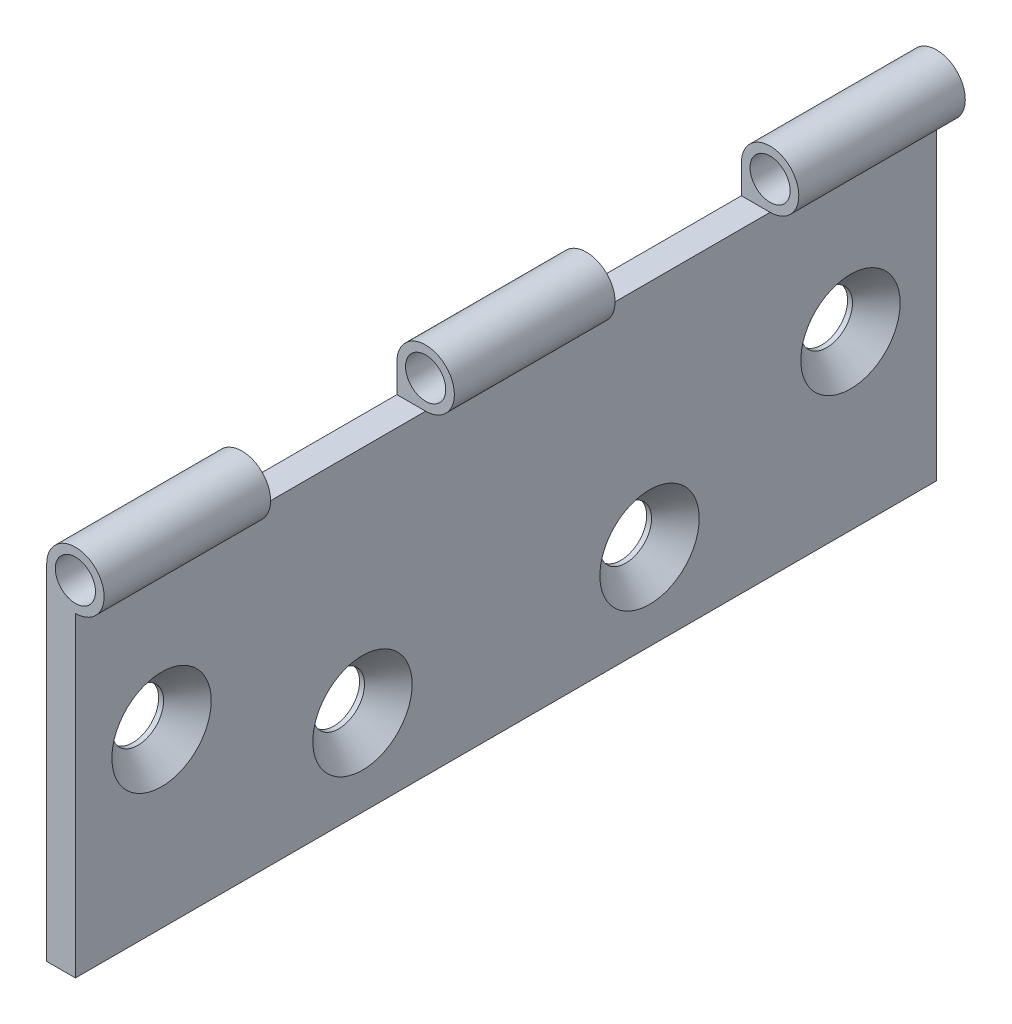
ISO-10303-21;
HEADER;
FILE_DESCRIPTION(('STEP AP214'),'2;1');
FILE_NAME('part.step','',(''),(''),'','','');
FILE_SCHEMA(('AUTOMOTIVE_DESIGN { 1 0 10303 214 1 1 1 1 }'));
ENDSEC;
DATA;
#1=APPLICATION_CONTEXT('core data for automotive mechanical design processes');
#2=APPLICATION_PROTOCOL_DEFINITION('international standard','automotive_design',2000,#1);
#3=PRODUCT_CONTEXT('',#1,'mechanical');
#4=PRODUCT('Part','Part','',(#3));
#5=PRODUCT_RELATED_PRODUCT_CATEGORY('part','',(#4));
#6=PRODUCT_DEFINITION_FORMATION('','',#4);
#7=PRODUCT_DEFINITION_CONTEXT('part definition',#1,'design');
#8=PRODUCT_DEFINITION('design','',#6,#7);
#9=PRODUCT_DEFINITION_SHAPE('','',#8);
#10=(LENGTH_UNIT() NAMED_UNIT(*) SI_UNIT(.MILLI.,.METRE.));
#11=(NAMED_UNIT(*) PLANE_ANGLE_UNIT() SI_UNIT($,.RADIAN.));
#12=(NAMED_UNIT(*) SI_UNIT($,.STERADIAN.) SOLID_ANGLE_UNIT());
#13=UNCERTAINTY_MEASURE_WITH_UNIT(LENGTH_MEASURE(1.E-05),#10,'distance_accuracy_value','');
#14=(GEOMETRIC_REPRESENTATION_CONTEXT(3) GLOBAL_UNCERTAINTY_ASSIGNED_CONTEXT((#13)) GLOBAL_UNIT_ASSIGNED_CONTEXT((#10,
#11,#12)) REPRESENTATION_CONTEXT('',''));
#15=CARTESIAN_POINT('',(0.,0.,0.));
#16=DIRECTION('',(0.,0.,1.));
#17=DIRECTION('',(1.,0.,0.));
#18=AXIS2_PLACEMENT_3D('',#15,#16,#17);
#19=CARTESIAN_POINT('',(0.,0.,75.));
#20=DIRECTION('',(-1.,0.,0.));
#21=DIRECTION('',(0.,0.,1.));
#22=AXIS2_PLACEMENT_3D('',#19,#20,#21);
#23=PLANE('',#22);
#24=CARTESIAN_POINT('',(0.,15.,-25.));
#25=DIRECTION('',(1.,0.,0.));
#26=DIRECTION('',(0.,0.,-1.));
#27=AXIS2_PLACEMENT_3D('',#24,#25,#26);
#28=CIRCLE('',#27,4.5);
#29=CARTESIAN_POINT('',(0.,15.,-29.5));
#30=VERTEX_POINT('',#29);
#31=EDGE_CURVE('E171',#30,#30,#28,.T.);
#32=ORIENTED_EDGE('',*,*,#31,.T.);
#33=EDGE_LOOP('',(#32));
#34=FACE_BOUND('',#33,.T.);
#35=CARTESIAN_POINT('',(0.,30.,-60.));
#36=DIRECTION('',(1.,0.,0.));
#37=DIRECTION('',(0.,0.,-1.));
#38=AXIS2_PLACEMENT_3D('',#35,#36,#37);
#39=CIRCLE('',#38,4.5);
#40=CARTESIAN_POINT('',(0.,30.,-64.5));
#41=VERTEX_POINT('',#40);
#42=EDGE_CURVE('E180',#41,#41,#39,.T.);
#43=ORIENTED_EDGE('',*,*,#42,.T.);
#44=EDGE_LOOP('',(#43));
#45=FACE_BOUND('',#44,.T.);
#46=CARTESIAN_POINT('',(0.,15.,25.));
#47=DIRECTION('',(1.,0.,0.));
#48=DIRECTION('',(0.,0.,-1.));
#49=AXIS2_PLACEMENT_3D('',#46,#47,#48);
#50=CIRCLE('',#49,4.5);
#51=CARTESIAN_POINT('',(0.,15.,20.5));
#52=VERTEX_POINT('',#51);
#53=EDGE_CURVE('E189',#52,#52,#50,.T.);
#54=ORIENTED_EDGE('',*,*,#53,.T.);
#55=EDGE_LOOP('',(#54));
#56=FACE_BOUND('',#55,.T.);
#57=CARTESIAN_POINT('',(0.,30.,60.));
#58=DIRECTION('',(1.,0.,0.));
#59=DIRECTION('',(0.,0.,-1.));
#60=AXIS2_PLACEMENT_3D('',#57,#58,#59);
#61=CIRCLE('',#60,4.5);
#62=CARTESIAN_POINT('',(0.,30.,55.5));
#63=VERTEX_POINT('',#62);
#64=EDGE_CURVE('E198',#63,#63,#61,.T.);
#65=ORIENTED_EDGE('',*,*,#64,.T.);
#66=EDGE_LOOP('',(#65));
#67=FACE_BOUND('',#66,.T.);
#68=DIRECTION('',(0.,0.,-1.));
#69=VECTOR('',#68,1.);
#70=CARTESIAN_POINT('',(0.,60.,75.));
#71=LINE('',#70,#69);
#72=CARTESIAN_POINT('',(0.,60.,14.));
#73=VERTEX_POINT('',#72);
#74=CARTESIAN_POINT('',(0.,60.,-14.));
#75=VERTEX_POINT('',#74);
#76=EDGE_CURVE('E45',#73,#75,#71,.T.);
#77=ORIENTED_EDGE('',*,*,#76,.T.);
#78=DIRECTION('',(0.,1.,0.));
#79=VECTOR('',#78,1.);
#80=CARTESIAN_POINT('',(0.,0.,-14.));
#81=LINE('',#80,#79);
#82=CARTESIAN_POINT('',(0.,55.,-14.));
#83=VERTEX_POINT('',#82);
#84=EDGE_CURVE('E135',#83,#75,#81,.T.);
#85=ORIENTED_EDGE('',*,*,#84,.F.);
#86=DIRECTION('',(0.,0.,1.));
#87=VECTOR('',#86,1.);
#88=CARTESIAN_POINT('',(0.,55.,0.));
#89=LINE('',#88,#87);
#90=CARTESIAN_POINT('',(0.,55.,-46.));
#91=VERTEX_POINT('',#90);
#92=EDGE_CURVE('E123',#91,#83,#89,.T.);
#93=ORIENTED_EDGE('',*,*,#92,.F.);
#94=DIRECTION('',(0.,1.,0.));
#95=VECTOR('',#94,1.);
#96=CARTESIAN_POINT('',(0.,0.,-46.));
#97=LINE('',#96,#95);
#98=CARTESIAN_POINT('',(0.,60.,-46.));
#99=VERTEX_POINT('',#98);
#100=EDGE_CURVE('E134',#91,#99,#97,.T.);
#101=ORIENTED_EDGE('',*,*,#100,.T.);
#102=CARTESIAN_POINT('',(0.,60.,-75.));
#103=VERTEX_POINT('',#102);
#104=EDGE_CURVE('E47',#99,#103,#71,.T.);
#105=ORIENTED_EDGE('',*,*,#104,.T.);
#106=DIRECTION('',(0.,1.,0.));
#107=VECTOR('',#106,1.);
#108=CARTESIAN_POINT('',(0.,0.,-75.));
#109=LINE('',#108,#107);
#110=CARTESIAN_POINT('',(0.,0.,-75.));
#111=VERTEX_POINT('',#110);
#112=EDGE_CURVE('E234',#111,#103,#109,.T.);
#113=ORIENTED_EDGE('',*,*,#112,.F.);
#114=DIRECTION('',(0.,0.,-1.));
#115=VECTOR('',#114,1.);
#116=CARTESIAN_POINT('',(0.,0.,75.));
#117=LINE('',#116,#115);
#118=CARTESIAN_POINT('',(0.,0.,75.));
#119=VERTEX_POINT('',#118);
#120=EDGE_CURVE('E240',#119,#111,#117,.T.);
#121=ORIENTED_EDGE('',*,*,#120,.F.);
#122=DIRECTION('',(0.,1.,0.));
#123=VECTOR('',#122,1.);
#124=CARTESIAN_POINT('',(0.,0.,75.));
#125=LINE('',#124,#123);
#126=CARTESIAN_POINT('',(0.,60.,75.));
#127=VERTEX_POINT('',#126);
#128=EDGE_CURVE('E224',#119,#127,#125,.T.);
#129=ORIENTED_EDGE('',*,*,#128,.T.);
#130=CARTESIAN_POINT('',(0.,60.,46.));
#131=VERTEX_POINT('',#130);
#132=EDGE_CURVE('E11',#127,#131,#71,.T.);
#133=ORIENTED_EDGE('',*,*,#132,.T.);
#134=DIRECTION('',(0.,1.,0.));
#135=VECTOR('',#134,1.);
#136=CARTESIAN_POINT('',(0.,0.,46.));
#137=LINE('',#136,#135);
#138=CARTESIAN_POINT('',(0.,55.,46.));
#139=VERTEX_POINT('',#138);
#140=EDGE_CURVE('E153',#139,#131,#137,.T.);
#141=ORIENTED_EDGE('',*,*,#140,.F.);
#142=DIRECTION('',(0.,0.,1.));
#143=VECTOR('',#142,1.);
#144=CARTESIAN_POINT('',(0.,55.,0.));
#145=LINE('',#144,#143);
#146=CARTESIAN_POINT('',(0.,55.,14.));
#147=VERTEX_POINT('',#146);
#148=EDGE_CURVE('E149',#147,#139,#145,.T.);
#149=ORIENTED_EDGE('',*,*,#148,.F.);
#150=DIRECTION('',(0.,1.,0.));
#151=VECTOR('',#150,1.);
#152=CARTESIAN_POINT('',(0.,0.,14.));
#153=LINE('',#152,#151);
#154=EDGE_CURVE('E151',#147,#73,#153,.T.);
#155=ORIENTED_EDGE('',*,*,#154,.T.);
#156=EDGE_LOOP('',(#77,#85,#93,#101,#105,#113,#121,#129,#133,#141,#149,#155));
#157=FACE_BOUND('',#156,.T.);
#158=ADVANCED_FACE('F36',(#34,#45,#56,#67,#157),#23,.T.);
#159=CARTESIAN_POINT('',(5.,60.,75.));
#160=DIRECTION('',(0.,0.,-1.));
#161=DIRECTION('',(-1.,0.,0.));
#162=AXIS2_PLACEMENT_3D('',#159,#160,#161);
#163=CYLINDRICAL_SURFACE('',#162,5.);
#164=CARTESIAN_POINT('',(5.,60.,-14.));
#165=DIRECTION('',(0.,0.,-1.));
#166=DIRECTION('',(-1.,0.,0.));
#167=AXIS2_PLACEMENT_3D('',#164,#165,#166);
#168=CIRCLE('',#167,5.);
#169=CARTESIAN_POINT('',(5.,55.,-14.));
#170=VERTEX_POINT('',#169);
#171=EDGE_CURVE('E54',#75,#170,#168,.T.);
#172=ORIENTED_EDGE('',*,*,#171,.F.);
#173=ORIENTED_EDGE('',*,*,#76,.F.);
#174=CARTESIAN_POINT('',(5.,60.,14.));
#175=DIRECTION('',(0.,0.,-1.));
#176=DIRECTION('',(-1.,0.,0.));
#177=AXIS2_PLACEMENT_3D('',#174,#175,#176);
#178=CIRCLE('',#177,5.);
#179=CARTESIAN_POINT('',(5.,55.,14.));
#180=VERTEX_POINT('',#179);
#181=EDGE_CURVE('E62',#73,#180,#178,.T.);
#182=ORIENTED_EDGE('',*,*,#181,.T.);
#183=DIRECTION('',(0.,0.,-1.));
#184=VECTOR('',#183,1.);
#185=CARTESIAN_POINT('',(5.,55.,75.));
#186=LINE('',#185,#184);
#187=EDGE_CURVE('E289',#180,#170,#186,.T.);
#188=ORIENTED_EDGE('',*,*,#187,.T.);
#189=EDGE_LOOP('',(#172,#173,#182,#188));
#190=FACE_BOUND('',#189,.T.);
#191=ADVANCED_FACE('F291',(#190),#163,.T.);
#192=ORIENTED_EDGE('',*,*,#104,.F.);
#193=CARTESIAN_POINT('',(5.,60.,-46.));
#194=DIRECTION('',(0.,0.,-1.));
#195=DIRECTION('',(-1.,0.,0.));
#196=AXIS2_PLACEMENT_3D('',#193,#194,#195);
#197=CIRCLE('',#196,5.);
#198=CARTESIAN_POINT('',(5.,55.,-46.));
#199=VERTEX_POINT('',#198);
#200=EDGE_CURVE('E146',#99,#199,#197,.T.);
#201=ORIENTED_EDGE('',*,*,#200,.T.);
#202=CARTESIAN_POINT('',(5.,55.,-75.));
#203=VERTEX_POINT('',#202);
#204=EDGE_CURVE('E215',#199,#203,#186,.T.);
#205=ORIENTED_EDGE('',*,*,#204,.T.);
#206=CARTESIAN_POINT('',(5.,60.,-75.));
#207=DIRECTION('',(0.,0.,1.));
#208=DIRECTION('',(1.,0.,0.));
#209=AXIS2_PLACEMENT_3D('',#206,#207,#208);
#210=CIRCLE('',#209,5.);
#211=CARTESIAN_POINT('',(10.,60.,-75.));
#212=VERTEX_POINT('',#211);
#213=EDGE_CURVE('E211',#203,#212,#210,.T.);
#214=ORIENTED_EDGE('',*,*,#213,.T.);
#215=EDGE_CURVE('E212',#212,#103,#210,.T.);
#216=ORIENTED_EDGE('',*,*,#215,.T.);
#217=EDGE_LOOP('',(#192,#201,#205,#214,#216));
#218=FACE_BOUND('',#217,.T.);
#219=ADVANCED_FACE('F259',(#218),#163,.T.);
#220=CARTESIAN_POINT('',(5.,60.,-75.));
#221=DIRECTION('',(0.,0.,1.));
#222=DIRECTION('',(1.,0.,0.));
#223=AXIS2_PLACEMENT_3D('',#220,#221,#222);
#224=CYLINDRICAL_SURFACE('',#223,3.5);
#225=CARTESIAN_POINT('',(5.,60.,14.));
#226=DIRECTION('',(0.,0.,-1.));
#227=DIRECTION('',(-1.,0.,0.));
#228=AXIS2_PLACEMENT_3D('',#225,#226,#227);
#229=CIRCLE('',#228,3.5);
#230=CARTESIAN_POINT('',(1.5,60.,14.));
#231=VERTEX_POINT('',#230);
#232=EDGE_CURVE('E159',#231,#231,#229,.F.);
#233=ORIENTED_EDGE('',*,*,#232,.T.);
#234=EDGE_LOOP('',(#233));
#235=FACE_BOUND('',#234,.T.);
#236=CARTESIAN_POINT('',(5.,60.,-14.));
#237=DIRECTION('',(0.,0.,-1.));
#238=DIRECTION('',(-1.,0.,0.));
#239=AXIS2_PLACEMENT_3D('',#236,#237,#238);
#240=CIRCLE('',#239,3.5);
#241=CARTESIAN_POINT('',(1.5,60.,-14.));
#242=VERTEX_POINT('',#241);
#243=EDGE_CURVE('E40',#242,#242,#240,.F.);
#244=ORIENTED_EDGE('',*,*,#243,.F.);
#245=EDGE_LOOP('',(#244));
#246=FACE_BOUND('',#245,.T.);
#247=ADVANCED_FACE('F298',(#235,#246),#224,.F.);
#248=CARTESIAN_POINT('',(5.,60.,46.));
#249=DIRECTION('',(0.,0.,-1.));
#250=DIRECTION('',(-1.,0.,0.));
#251=AXIS2_PLACEMENT_3D('',#248,#249,#250);
#252=CIRCLE('',#251,5.);
#253=CARTESIAN_POINT('',(5.,55.,46.));
#254=VERTEX_POINT('',#253);
#255=EDGE_CURVE('E163',#131,#254,#252,.T.);
#256=ORIENTED_EDGE('',*,*,#255,.F.);
#257=ORIENTED_EDGE('',*,*,#132,.F.);
#258=CARTESIAN_POINT('',(5.,60.,75.));
#259=DIRECTION('',(0.,0.,1.));
#260=DIRECTION('',(1.,0.,0.));
#261=AXIS2_PLACEMENT_3D('',#258,#259,#260);
#262=CIRCLE('',#261,5.);
#263=CARTESIAN_POINT('',(10.,60.,75.));
#264=VERTEX_POINT('',#263);
#265=EDGE_CURVE('E208',#264,#127,#262,.T.);
#266=ORIENTED_EDGE('',*,*,#265,.F.);
#267=CARTESIAN_POINT('',(5.,55.,75.));
#268=VERTEX_POINT('',#267);
#269=EDGE_CURVE('E205',#268,#264,#262,.T.);
#270=ORIENTED_EDGE('',*,*,#269,.F.);
#271=EDGE_CURVE('E216',#268,#254,#186,.T.);
#272=ORIENTED_EDGE('',*,*,#271,.T.);
#273=EDGE_LOOP('',(#256,#257,#266,#270,#272));
#274=FACE_BOUND('',#273,.T.);
#275=ADVANCED_FACE('F279',(#274),#163,.T.);
#276=CARTESIAN_POINT('',(5.,60.,75.));
#277=DIRECTION('',(0.,0.,1.));
#278=DIRECTION('',(1.,0.,0.));
#279=AXIS2_PLACEMENT_3D('',#276,#277,#278);
#280=CIRCLE('',#279,3.5);
#281=CARTESIAN_POINT('',(8.5,60.,75.));
#282=VERTEX_POINT('',#281);
#283=EDGE_CURVE('E201',#282,#282,#280,.T.);
#284=ORIENTED_EDGE('',*,*,#283,.T.);
#285=EDGE_LOOP('',(#284));
#286=FACE_BOUND('',#285,.T.);
#287=CARTESIAN_POINT('',(5.,60.,46.));
#288=DIRECTION('',(0.,0.,-1.));
#289=DIRECTION('',(-1.,0.,0.));
#290=AXIS2_PLACEMENT_3D('',#287,#288,#289);
#291=CIRCLE('',#290,3.5);
#292=CARTESIAN_POINT('',(1.5,60.,46.));
#293=VERTEX_POINT('',#292);
#294=EDGE_CURVE('E162',#293,#293,#291,.F.);
#295=ORIENTED_EDGE('',*,*,#294,.F.);
#296=EDGE_LOOP('',(#295));
#297=FACE_BOUND('',#296,.T.);
#298=ADVANCED_FACE('F303',(#286,#297),#224,.F.);
#299=CARTESIAN_POINT('',(5.,0.,75.));
#300=DIRECTION('',(-1.,0.,0.));
#301=DIRECTION('',(0.,0.,1.));
#302=AXIS2_PLACEMENT_3D('',#299,#300,#301);
#303=PLANE('',#302);
#304=CARTESIAN_POINT('',(5.,15.,-25.));
#305=DIRECTION('',(1.,0.,0.));
#306=DIRECTION('',(0.,0.,-1.));
#307=AXIS2_PLACEMENT_3D('',#304,#305,#306);
#308=CIRCLE('',#307,8.65);
#309=CARTESIAN_POINT('',(5.,15.,-33.65));
#310=VERTEX_POINT('',#309);
#311=EDGE_CURVE('E165',#310,#310,#308,.T.);
#312=ORIENTED_EDGE('',*,*,#311,.F.);
#313=EDGE_LOOP('',(#312));
#314=FACE_BOUND('',#313,.T.);
#315=CARTESIAN_POINT('',(5.,30.,-60.));
#316=DIRECTION('',(1.,0.,0.));
#317=DIRECTION('',(0.,0.,-1.));
#318=AXIS2_PLACEMENT_3D('',#315,#316,#317);
#319=CIRCLE('',#318,8.65);
#320=CARTESIAN_POINT('',(5.,30.,-68.65));
#321=VERTEX_POINT('',#320);
#322=EDGE_CURVE('E174',#321,#321,#319,.T.);
#323=ORIENTED_EDGE('',*,*,#322,.F.);
#324=EDGE_LOOP('',(#323));
#325=FACE_BOUND('',#324,.T.);
#326=CARTESIAN_POINT('',(5.,15.,25.));
#327=DIRECTION('',(1.,0.,0.));
#328=DIRECTION('',(0.,0.,-1.));
#329=AXIS2_PLACEMENT_3D('',#326,#327,#328);
#330=CIRCLE('',#329,8.65);
#331=CARTESIAN_POINT('',(5.,15.,16.35));
#332=VERTEX_POINT('',#331);
#333=EDGE_CURVE('E183',#332,#332,#330,.T.);
#334=ORIENTED_EDGE('',*,*,#333,.F.);
#335=EDGE_LOOP('',(#334));
#336=FACE_BOUND('',#335,.T.);
#337=CARTESIAN_POINT('',(5.,30.,60.));
#338=DIRECTION('',(1.,0.,0.));
#339=DIRECTION('',(0.,0.,-1.));
#340=AXIS2_PLACEMENT_3D('',#337,#338,#339);
#341=CIRCLE('',#340,8.65);
#342=CARTESIAN_POINT('',(5.,30.,51.35));
#343=VERTEX_POINT('',#342);
#344=EDGE_CURVE('E192',#343,#343,#341,.T.);
#345=ORIENTED_EDGE('',*,*,#344,.F.);
#346=EDGE_LOOP('',(#345));
#347=FACE_BOUND('',#346,.T.);
#348=ORIENTED_EDGE('',*,*,#271,.F.);
#349=DIRECTION('',(0.,1.,0.));
#350=VECTOR('',#349,1.);
#351=CARTESIAN_POINT('',(5.,0.,75.));
#352=LINE('',#351,#350);
#353=CARTESIAN_POINT('',(5.,0.,75.));
#354=VERTEX_POINT('',#353);
#355=EDGE_CURVE('E221',#354,#268,#352,.T.);
#356=ORIENTED_EDGE('',*,*,#355,.F.);
#357=DIRECTION('',(0.,0.,-1.));
#358=VECTOR('',#357,1.);
#359=CARTESIAN_POINT('',(5.,0.,75.));
#360=LINE('',#359,#358);
#361=CARTESIAN_POINT('',(5.,0.,-75.));
#362=VERTEX_POINT('',#361);
#363=EDGE_CURVE('E231',#354,#362,#360,.T.);
#364=ORIENTED_EDGE('',*,*,#363,.T.);
#365=DIRECTION('',(0.,1.,0.));
#366=VECTOR('',#365,1.);
#367=CARTESIAN_POINT('',(5.,0.,-75.));
#368=LINE('',#367,#366);
#369=EDGE_CURVE('E219',#362,#203,#368,.T.);
#370=ORIENTED_EDGE('',*,*,#369,.T.);
#371=ORIENTED_EDGE('',*,*,#204,.F.);
#372=EDGE_CURVE('E290',#170,#199,#186,.T.);
#373=ORIENTED_EDGE('',*,*,#372,.F.);
#374=ORIENTED_EDGE('',*,*,#187,.F.);
#375=EDGE_CURVE('E220',#254,#180,#186,.T.);
#376=ORIENTED_EDGE('',*,*,#375,.F.);
#377=EDGE_LOOP('',(#348,#356,#364,#370,#371,#373,#374,#376));
#378=FACE_BOUND('',#377,.T.);
#379=ADVANCED_FACE('F38',(#314,#325,#336,#347,#378),#303,.F.);
#380=CARTESIAN_POINT('',(5.,0.,75.));
#381=DIRECTION('',(0.,-1.,0.));
#382=DIRECTION('',(0.,0.,-1.));
#383=AXIS2_PLACEMENT_3D('',#380,#381,#382);
#384=PLANE('',#383);
#385=DIRECTION('',(-1.,0.,0.));
#386=VECTOR('',#385,1.);
#387=CARTESIAN_POINT('',(5.,0.,-75.));
#388=LINE('',#387,#386);
#389=EDGE_CURVE('E225',#362,#111,#388,.T.);
#390=ORIENTED_EDGE('',*,*,#389,.F.);
#391=ORIENTED_EDGE('',*,*,#363,.F.);
#392=DIRECTION('',(-1.,0.,0.));
#393=VECTOR('',#392,1.);
#394=CARTESIAN_POINT('',(5.,0.,75.));
#395=LINE('',#394,#393);
#396=EDGE_CURVE('E228',#354,#119,#395,.T.);
#397=ORIENTED_EDGE('',*,*,#396,.T.);
#398=ORIENTED_EDGE('',*,*,#120,.T.);
#399=EDGE_LOOP('',(#390,#391,#397,#398));
#400=FACE_BOUND('',#399,.T.);
#401=ADVANCED_FACE('F272',(#400),#384,.T.);
#402=CARTESIAN_POINT('',(0.,0.,75.));
#403=DIRECTION('',(0.,0.,-1.));
#404=DIRECTION('',(-1.,0.,0.));
#405=AXIS2_PLACEMENT_3D('',#402,#403,#404);
#406=PLANE('',#405);
#407=ORIENTED_EDGE('',*,*,#283,.F.);
#408=EDGE_LOOP('',(#407));
#409=FACE_BOUND('',#408,.T.);
#410=ORIENTED_EDGE('',*,*,#355,.T.);
#411=ORIENTED_EDGE('',*,*,#269,.T.);
#412=ORIENTED_EDGE('',*,*,#265,.T.);
#413=ORIENTED_EDGE('',*,*,#128,.F.);
#414=ORIENTED_EDGE('',*,*,#396,.F.);
#415=EDGE_LOOP('',(#410,#411,#412,#413,#414));
#416=FACE_BOUND('',#415,.T.);
#417=ADVANCED_FACE('F270',(#409,#416),#406,.F.);
#418=CARTESIAN_POINT('',(0.,0.,-75.));
#419=DIRECTION('',(0.,0.,-1.));
#420=DIRECTION('',(-1.,0.,0.));
#421=AXIS2_PLACEMENT_3D('',#418,#419,#420);
#422=PLANE('',#421);
#423=CARTESIAN_POINT('',(5.,60.,-75.));
#424=DIRECTION('',(0.,0.,1.));
#425=DIRECTION('',(1.,0.,0.));
#426=AXIS2_PLACEMENT_3D('',#423,#424,#425);
#427=CIRCLE('',#426,3.5);
#428=CARTESIAN_POINT('',(8.5,60.,-75.));
#429=VERTEX_POINT('',#428);
#430=EDGE_CURVE('E202',#429,#429,#427,.T.);
#431=ORIENTED_EDGE('',*,*,#430,.T.);
#432=EDGE_LOOP('',(#431));
#433=FACE_BOUND('',#432,.T.);
#434=ORIENTED_EDGE('',*,*,#112,.T.);
#435=ORIENTED_EDGE('',*,*,#215,.F.);
#436=ORIENTED_EDGE('',*,*,#213,.F.);
#437=ORIENTED_EDGE('',*,*,#369,.F.);
#438=ORIENTED_EDGE('',*,*,#389,.T.);
#439=EDGE_LOOP('',(#434,#435,#436,#437,#438));
#440=FACE_BOUND('',#439,.T.);
#441=ADVANCED_FACE('F263',(#433,#440),#422,.T.);
#442=CARTESIAN_POINT('',(5.,60.,-46.));
#443=DIRECTION('',(0.,0.,-1.));
#444=DIRECTION('',(-1.,0.,0.));
#445=AXIS2_PLACEMENT_3D('',#442,#443,#444);
#446=CIRCLE('',#445,3.5);
#447=CARTESIAN_POINT('',(1.5,60.,-46.));
#448=VERTEX_POINT('',#447);
#449=EDGE_CURVE('E144',#448,#448,#446,.F.);
#450=ORIENTED_EDGE('',*,*,#449,.T.);
#451=EDGE_LOOP('',(#450));
#452=FACE_BOUND('',#451,.T.);
#453=ORIENTED_EDGE('',*,*,#430,.F.);
#454=EDGE_LOOP('',(#453));
#455=FACE_BOUND('',#454,.T.);
#456=ADVANCED_FACE('F248',(#452,#455),#224,.F.);
#457=CARTESIAN_POINT('',(5.,30.,60.));
#458=DIRECTION('',(1.,0.,0.));
#459=DIRECTION('',(0.,0.,-1.));
#460=AXIS2_PLACEMENT_3D('',#457,#458,#459);
#461=CYLINDRICAL_SURFACE('',#460,4.5);
#462=ORIENTED_EDGE('',*,*,#64,.F.);
#463=EDGE_LOOP('',(#462));
#464=FACE_BOUND('',#463,.T.);
#465=CARTESIAN_POINT('',(0.850000000000003,30.,60.));
#466=DIRECTION('',(1.,0.,0.));
#467=DIRECTION('',(0.,0.,-1.));
#468=AXIS2_PLACEMENT_3D('',#465,#466,#467);
#469=CIRCLE('',#468,4.5);
#470=CARTESIAN_POINT('',(0.850000000000003,30.,55.5));
#471=VERTEX_POINT('',#470);
#472=EDGE_CURVE('E195',#471,#471,#469,.T.);
#473=ORIENTED_EDGE('',*,*,#472,.T.);
#474=EDGE_LOOP('',(#473));
#475=FACE_BOUND('',#474,.T.);
#476=ADVANCED_FACE('F315',(#464,#475),#461,.F.);
#477=CARTESIAN_POINT('',(5.,30.,60.));
#478=DIRECTION('',(1.,0.,0.));
#479=DIRECTION('',(0.,0.,-1.));
#480=AXIS2_PLACEMENT_3D('',#477,#478,#479);
#481=CONICAL_SURFACE('',#480,8.65,0.785398163397449);
#482=ORIENTED_EDGE('',*,*,#472,.F.);
#483=EDGE_LOOP('',(#482));
#484=FACE_BOUND('',#483,.T.);
#485=ORIENTED_EDGE('',*,*,#344,.T.);
#486=EDGE_LOOP('',(#485));
#487=FACE_BOUND('',#486,.T.);
#488=ADVANCED_FACE('F320',(#484,#487),#481,.F.);
#489=CARTESIAN_POINT('',(5.,15.,25.));
#490=DIRECTION('',(1.,0.,0.));
#491=DIRECTION('',(0.,0.,-1.));
#492=AXIS2_PLACEMENT_3D('',#489,#490,#491);
#493=CYLINDRICAL_SURFACE('',#492,4.5);
#494=ORIENTED_EDGE('',*,*,#53,.F.);
#495=EDGE_LOOP('',(#494));
#496=FACE_BOUND('',#495,.T.);
#497=CARTESIAN_POINT('',(0.850000000000003,15.,25.));
#498=DIRECTION('',(1.,0.,0.));
#499=DIRECTION('',(0.,0.,-1.));
#500=AXIS2_PLACEMENT_3D('',#497,#498,#499);
#501=CIRCLE('',#500,4.5);
#502=CARTESIAN_POINT('',(0.850000000000003,15.,20.5));
#503=VERTEX_POINT('',#502);
#504=EDGE_CURVE('E186',#503,#503,#501,.T.);
#505=ORIENTED_EDGE('',*,*,#504,.T.);
#506=EDGE_LOOP('',(#505));
#507=FACE_BOUND('',#506,.T.);
#508=ADVANCED_FACE('F345',(#496,#507),#493,.F.);
#509=CARTESIAN_POINT('',(5.,15.,25.));
#510=DIRECTION('',(1.,0.,0.));
#511=DIRECTION('',(0.,0.,-1.));
#512=AXIS2_PLACEMENT_3D('',#509,#510,#511);
#513=CONICAL_SURFACE('',#512,8.65,0.785398163397449);
#514=ORIENTED_EDGE('',*,*,#504,.F.);
#515=EDGE_LOOP('',(#514));
#516=FACE_BOUND('',#515,.T.);
#517=ORIENTED_EDGE('',*,*,#333,.T.);
#518=EDGE_LOOP('',(#517));
#519=FACE_BOUND('',#518,.T.);
#520=ADVANCED_FACE('F351',(#516,#519),#513,.F.);
#521=CARTESIAN_POINT('',(5.,30.,-60.));
#522=DIRECTION('',(1.,0.,0.));
#523=DIRECTION('',(0.,0.,-1.));
#524=AXIS2_PLACEMENT_3D('',#521,#522,#523);
#525=CYLINDRICAL_SURFACE('',#524,4.5);
#526=ORIENTED_EDGE('',*,*,#42,.F.);
#527=EDGE_LOOP('',(#526));
#528=FACE_BOUND('',#527,.T.);
#529=CARTESIAN_POINT('',(0.850000000000003,30.,-60.));
#530=DIRECTION('',(1.,0.,0.));
#531=DIRECTION('',(0.,0.,-1.));
#532=AXIS2_PLACEMENT_3D('',#529,#530,#531);
#533=CIRCLE('',#532,4.5);
#534=CARTESIAN_POINT('',(0.850000000000003,30.,-64.5));
#535=VERTEX_POINT('',#534);
#536=EDGE_CURVE('E177',#535,#535,#533,.T.);
#537=ORIENTED_EDGE('',*,*,#536,.T.);
#538=EDGE_LOOP('',(#537));
#539=FACE_BOUND('',#538,.T.);
#540=ADVANCED_FACE('F358',(#528,#539),#525,.F.);
#541=CARTESIAN_POINT('',(5.,30.,-60.));
#542=DIRECTION('',(1.,0.,0.));
#543=DIRECTION('',(0.,0.,-1.));
#544=AXIS2_PLACEMENT_3D('',#541,#542,#543);
#545=CONICAL_SURFACE('',#544,8.65,0.785398163397449);
#546=ORIENTED_EDGE('',*,*,#536,.F.);
#547=EDGE_LOOP('',(#546));
#548=FACE_BOUND('',#547,.T.);
#549=ORIENTED_EDGE('',*,*,#322,.T.);
#550=EDGE_LOOP('',(#549));
#551=FACE_BOUND('',#550,.T.);
#552=ADVANCED_FACE('F362',(#548,#551),#545,.F.);
#553=CARTESIAN_POINT('',(5.,15.,-25.));
#554=DIRECTION('',(1.,0.,0.));
#555=DIRECTION('',(0.,0.,-1.));
#556=AXIS2_PLACEMENT_3D('',#553,#554,#555);
#557=CYLINDRICAL_SURFACE('',#556,4.5);
#558=ORIENTED_EDGE('',*,*,#31,.F.);
#559=EDGE_LOOP('',(#558));
#560=FACE_BOUND('',#559,.T.);
#561=CARTESIAN_POINT('',(0.850000000000003,15.,-25.));
#562=DIRECTION('',(1.,0.,0.));
#563=DIRECTION('',(0.,0.,-1.));
#564=AXIS2_PLACEMENT_3D('',#561,#562,#563);
#565=CIRCLE('',#564,4.5);
#566=CARTESIAN_POINT('',(0.850000000000003,15.,-29.5));
#567=VERTEX_POINT('',#566);
#568=EDGE_CURVE('E168',#567,#567,#565,.T.);
#569=ORIENTED_EDGE('',*,*,#568,.T.);
#570=EDGE_LOOP('',(#569));
#571=FACE_BOUND('',#570,.T.);
#572=ADVANCED_FACE('F366',(#560,#571),#557,.F.);
#573=CARTESIAN_POINT('',(5.,15.,-25.));
#574=DIRECTION('',(1.,0.,0.));
#575=DIRECTION('',(0.,0.,-1.));
#576=AXIS2_PLACEMENT_3D('',#573,#574,#575);
#577=CONICAL_SURFACE('',#576,8.65,0.785398163397449);
#578=ORIENTED_EDGE('',*,*,#568,.F.);
#579=EDGE_LOOP('',(#578));
#580=FACE_BOUND('',#579,.T.);
#581=ORIENTED_EDGE('',*,*,#311,.T.);
#582=EDGE_LOOP('',(#581));
#583=FACE_BOUND('',#582,.T.);
#584=ADVANCED_FACE('F370',(#580,#583),#577,.F.);
#585=CARTESIAN_POINT('',(0.,55.,0.));
#586=DIRECTION('',(0.,1.,0.));
#587=DIRECTION('',(0.,0.,1.));
#588=AXIS2_PLACEMENT_3D('',#585,#586,#587);
#589=PLANE('',#588);
#590=ORIENTED_EDGE('',*,*,#375,.T.);
#591=DIRECTION('',(1.,0.,0.));
#592=VECTOR('',#591,1.);
#593=CARTESIAN_POINT('',(0.,55.,14.));
#594=LINE('',#593,#592);
#595=EDGE_CURVE('E155',#147,#180,#594,.T.);
#596=ORIENTED_EDGE('',*,*,#595,.F.);
#597=ORIENTED_EDGE('',*,*,#148,.T.);
#598=DIRECTION('',(1.,0.,0.));
#599=VECTOR('',#598,1.);
#600=CARTESIAN_POINT('',(0.,55.,46.));
#601=LINE('',#600,#599);
#602=EDGE_CURVE('E156',#139,#254,#601,.T.);
#603=ORIENTED_EDGE('',*,*,#602,.T.);
#604=EDGE_LOOP('',(#590,#596,#597,#603));
#605=FACE_BOUND('',#604,.T.);
#606=ADVANCED_FACE('F287',(#605),#589,.T.);
#607=CARTESIAN_POINT('',(0.,0.,46.));
#608=DIRECTION('',(0.,0.,-1.));
#609=DIRECTION('',(-1.,0.,0.));
#610=AXIS2_PLACEMENT_3D('',#607,#608,#609);
#611=PLANE('',#610);
#612=ORIENTED_EDGE('',*,*,#294,.T.);
#613=EDGE_LOOP('',(#612));
#614=FACE_BOUND('',#613,.T.);
#615=ORIENTED_EDGE('',*,*,#255,.T.);
#616=ORIENTED_EDGE('',*,*,#602,.F.);
#617=ORIENTED_EDGE('',*,*,#140,.T.);
#618=EDGE_LOOP('',(#615,#616,#617));
#619=FACE_BOUND('',#618,.T.);
#620=ADVANCED_FACE('F284',(#614,#619),#611,.T.);
#621=CARTESIAN_POINT('',(0.,0.,14.));
#622=DIRECTION('',(0.,0.,-1.));
#623=DIRECTION('',(-1.,0.,0.));
#624=AXIS2_PLACEMENT_3D('',#621,#622,#623);
#625=PLANE('',#624);
#626=ORIENTED_EDGE('',*,*,#232,.F.);
#627=EDGE_LOOP('',(#626));
#628=FACE_BOUND('',#627,.T.);
#629=ORIENTED_EDGE('',*,*,#154,.F.);
#630=ORIENTED_EDGE('',*,*,#595,.T.);
#631=ORIENTED_EDGE('',*,*,#181,.F.);
#632=EDGE_LOOP('',(#629,#630,#631));
#633=FACE_BOUND('',#632,.T.);
#634=ADVANCED_FACE('F377',(#628,#633),#625,.F.);
#635=CARTESIAN_POINT('',(0.,55.,0.));
#636=DIRECTION('',(0.,1.,0.));
#637=DIRECTION('',(0.,0.,1.));
#638=AXIS2_PLACEMENT_3D('',#635,#636,#637);
#639=PLANE('',#638);
#640=ORIENTED_EDGE('',*,*,#372,.T.);
#641=DIRECTION('',(1.,0.,0.));
#642=VECTOR('',#641,1.);
#643=CARTESIAN_POINT('',(0.,55.,-46.));
#644=LINE('',#643,#642);
#645=EDGE_CURVE('E129',#91,#199,#644,.T.);
#646=ORIENTED_EDGE('',*,*,#645,.F.);
#647=ORIENTED_EDGE('',*,*,#92,.T.);
#648=DIRECTION('',(1.,0.,0.));
#649=VECTOR('',#648,1.);
#650=CARTESIAN_POINT('',(0.,55.,-14.));
#651=LINE('',#650,#649);
#652=EDGE_CURVE('E126',#83,#170,#651,.T.);
#653=ORIENTED_EDGE('',*,*,#652,.T.);
#654=EDGE_LOOP('',(#640,#646,#647,#653));
#655=FACE_BOUND('',#654,.T.);
#656=ADVANCED_FACE('F125',(#655),#639,.T.);
#657=CARTESIAN_POINT('',(0.,0.,-14.));
#658=DIRECTION('',(0.,0.,-1.));
#659=DIRECTION('',(-1.,0.,0.));
#660=AXIS2_PLACEMENT_3D('',#657,#658,#659);
#661=PLANE('',#660);
#662=ORIENTED_EDGE('',*,*,#243,.T.);
#663=EDGE_LOOP('',(#662));
#664=FACE_BOUND('',#663,.T.);
#665=ORIENTED_EDGE('',*,*,#171,.T.);
#666=ORIENTED_EDGE('',*,*,#652,.F.);
#667=ORIENTED_EDGE('',*,*,#84,.T.);
#668=EDGE_LOOP('',(#665,#666,#667));
#669=FACE_BOUND('',#668,.T.);
#670=ADVANCED_FACE('F137',(#664,#669),#661,.T.);
#671=CARTESIAN_POINT('',(0.,0.,-46.));
#672=DIRECTION('',(0.,0.,-1.));
#673=DIRECTION('',(-1.,0.,0.));
#674=AXIS2_PLACEMENT_3D('',#671,#672,#673);
#675=PLANE('',#674);
#676=ORIENTED_EDGE('',*,*,#449,.F.);
#677=EDGE_LOOP('',(#676));
#678=FACE_BOUND('',#677,.T.);
#679=ORIENTED_EDGE('',*,*,#100,.F.);
#680=ORIENTED_EDGE('',*,*,#645,.T.);
#681=ORIENTED_EDGE('',*,*,#200,.F.);
#682=EDGE_LOOP('',(#679,#680,#681));
#683=FACE_BOUND('',#682,.T.);
#684=ADVANCED_FACE('F251',(#678,#683),#675,.F.);
#685=CLOSED_SHELL('',(#158,#191,#219,#247,#275,#298,#379,#401,#417,#441,#456,#476,#488,#508,
#520,#540,#552,#572,#584,#606,#620,#634,#656,#670,#684));
#686=MANIFOLD_SOLID_BREP('B2',#685);
#687=ADVANCED_BREP_SHAPE_REPRESENTATION('',(#18,#686),#14);
#688=SHAPE_DEFINITION_REPRESENTATION(#9,#687);
ENDSEC;
END-ISO-10303-21;
